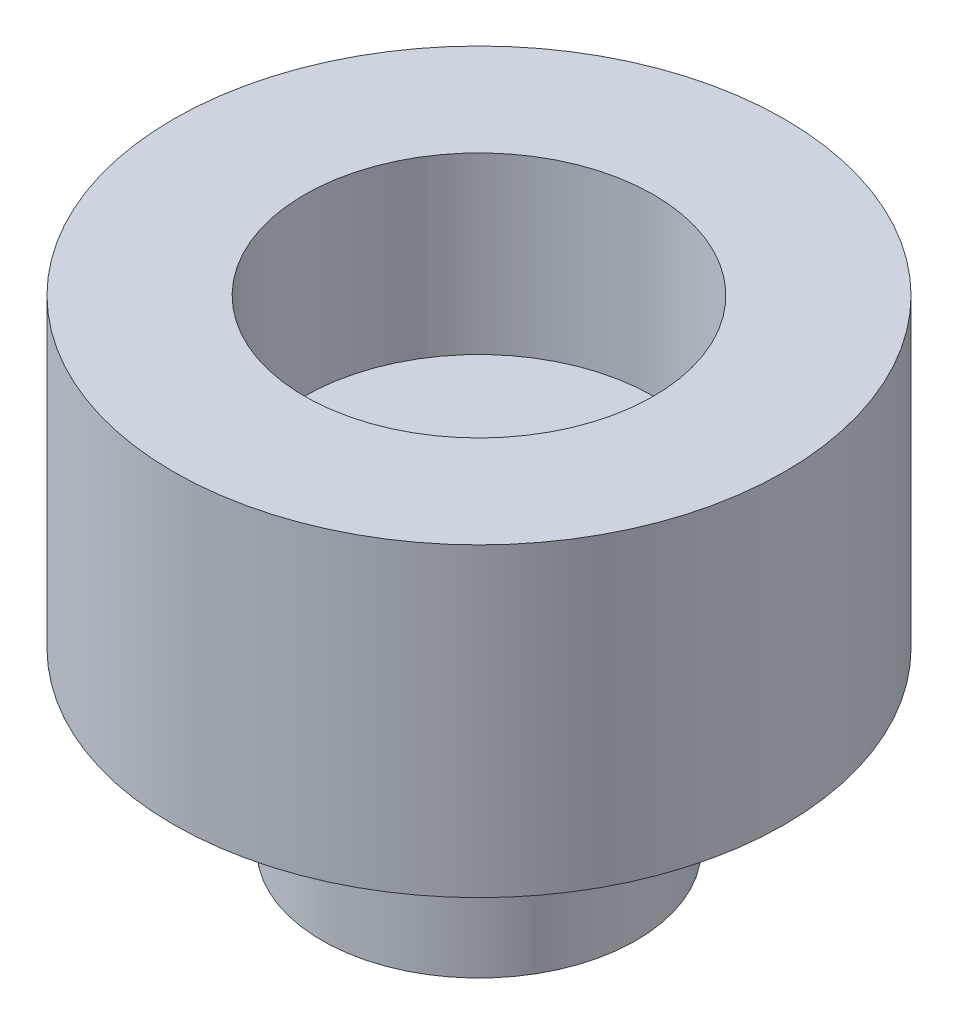
ISO-10303-21;
HEADER;
FILE_DESCRIPTION(('STEP AP214'),'2;1');
FILE_NAME('part.step','',(''),(''),'','','');
FILE_SCHEMA(('AUTOMOTIVE_DESIGN { 1 0 10303 214 1 1 1 1 }'));
ENDSEC;
DATA;
#1=APPLICATION_CONTEXT('core data for automotive mechanical design processes');
#2=APPLICATION_PROTOCOL_DEFINITION('international standard','automotive_design',2000,#1);
#3=PRODUCT_CONTEXT('',#1,'mechanical');
#4=PRODUCT('Part','Part','',(#3));
#5=PRODUCT_RELATED_PRODUCT_CATEGORY('part','',(#4));
#6=PRODUCT_DEFINITION_FORMATION('','',#4);
#7=PRODUCT_DEFINITION_CONTEXT('part definition',#1,'design');
#8=PRODUCT_DEFINITION('design','',#6,#7);
#9=PRODUCT_DEFINITION_SHAPE('','',#8);
#10=(LENGTH_UNIT() NAMED_UNIT(*) SI_UNIT(.MILLI.,.METRE.));
#11=(NAMED_UNIT(*) PLANE_ANGLE_UNIT() SI_UNIT($,.RADIAN.));
#12=(NAMED_UNIT(*) SI_UNIT($,.STERADIAN.) SOLID_ANGLE_UNIT());
#13=UNCERTAINTY_MEASURE_WITH_UNIT(LENGTH_MEASURE(1.E-05),#10,'distance_accuracy_value','');
#14=(GEOMETRIC_REPRESENTATION_CONTEXT(3) GLOBAL_UNCERTAINTY_ASSIGNED_CONTEXT((#13)) GLOBAL_UNIT_ASSIGNED_CONTEXT((#10,
#11,#12)) REPRESENTATION_CONTEXT('',''));
#15=CARTESIAN_POINT('',(0.,0.,0.));
#16=DIRECTION('',(0.,0.,1.));
#17=DIRECTION('',(1.,0.,0.));
#18=AXIS2_PLACEMENT_3D('',#15,#16,#17);
#19=CARTESIAN_POINT('',(1.8,0.,0.));
#20=DIRECTION('',(0.,-1.,0.));
#21=DIRECTION('',(0.,0.,-1.));
#22=AXIS2_PLACEMENT_3D('',#19,#20,#21);
#23=PLANE('',#22);
#24=CARTESIAN_POINT('',(0.,0.,0.));
#25=DIRECTION('',(0.,-1.,0.));
#26=DIRECTION('',(0.,0.,-1.));
#27=AXIS2_PLACEMENT_3D('',#24,#25,#26);
#28=CIRCLE('',#27,1.8);
#29=CARTESIAN_POINT('',(0.,0.,-1.8));
#30=VERTEX_POINT('',#29);
#31=EDGE_CURVE('E70',#30,#30,#28,.T.);
#32=ORIENTED_EDGE('',*,*,#31,.T.);
#33=EDGE_LOOP('',(#32));
#34=FACE_BOUND('',#33,.T.);
#35=ADVANCED_FACE('F43',(#34),#23,.T.);
#36=CARTESIAN_POINT('',(0.,3.5,0.));
#37=DIRECTION('',(0.,1.,0.));
#38=DIRECTION('',(0.,0.,1.));
#39=AXIS2_PLACEMENT_3D('',#36,#37,#38);
#40=PLANE('',#39);
#41=CARTESIAN_POINT('',(0.,3.5,0.));
#42=DIRECTION('',(0.,-1.,0.));
#43=DIRECTION('',(0.,0.,-1.));
#44=AXIS2_PLACEMENT_3D('',#41,#42,#43);
#45=CIRCLE('',#44,2.);
#46=CARTESIAN_POINT('',(0.,3.5,-2.));
#47=VERTEX_POINT('',#46);
#48=EDGE_CURVE('E10',#47,#47,#45,.T.);
#49=ORIENTED_EDGE('',*,*,#48,.F.);
#50=EDGE_LOOP('',(#49));
#51=FACE_BOUND('',#50,.T.);
#52=ADVANCED_FACE('F88',(#51),#40,.T.);
#53=CARTESIAN_POINT('',(0.,0.,0.));
#54=DIRECTION('',(0.,-1.,0.));
#55=DIRECTION('',(0.,0.,-1.));
#56=AXIS2_PLACEMENT_3D('',#53,#54,#55);
#57=CYLINDRICAL_SURFACE('',#56,2.);
#58=ORIENTED_EDGE('',*,*,#48,.T.);
#59=EDGE_LOOP('',(#58));
#60=FACE_BOUND('',#59,.T.);
#61=CARTESIAN_POINT('',(0.,5.5,0.));
#62=DIRECTION('',(0.,-1.,0.));
#63=DIRECTION('',(0.,0.,-1.));
#64=AXIS2_PLACEMENT_3D('',#61,#62,#63);
#65=CIRCLE('',#64,2.);
#66=CARTESIAN_POINT('',(0.,5.5,-2.));
#67=VERTEX_POINT('',#66);
#68=EDGE_CURVE('E50',#67,#67,#65,.T.);
#69=ORIENTED_EDGE('',*,*,#68,.F.);
#70=EDGE_LOOP('',(#69));
#71=FACE_BOUND('',#70,.T.);
#72=ADVANCED_FACE('F92',(#60,#71),#57,.F.);
#73=CARTESIAN_POINT('',(2.,5.5,0.));
#74=DIRECTION('',(0.,1.,0.));
#75=DIRECTION('',(0.,0.,1.));
#76=AXIS2_PLACEMENT_3D('',#73,#74,#75);
#77=PLANE('',#76);
#78=ORIENTED_EDGE('',*,*,#68,.T.);
#79=EDGE_LOOP('',(#78));
#80=FACE_BOUND('',#79,.T.);
#81=CARTESIAN_POINT('',(0.,5.5,0.));
#82=DIRECTION('',(0.,-1.,0.));
#83=DIRECTION('',(0.,0.,-1.));
#84=AXIS2_PLACEMENT_3D('',#81,#82,#83);
#85=CIRCLE('',#84,3.5);
#86=CARTESIAN_POINT('',(0.,5.5,-3.5));
#87=VERTEX_POINT('',#86);
#88=EDGE_CURVE('E55',#87,#87,#85,.T.);
#89=ORIENTED_EDGE('',*,*,#88,.F.);
#90=EDGE_LOOP('',(#89));
#91=FACE_BOUND('',#90,.T.);
#92=ADVANCED_FACE('F97',(#80,#91),#77,.T.);
#93=CARTESIAN_POINT('',(0.,0.,0.));
#94=DIRECTION('',(0.,-1.,0.));
#95=DIRECTION('',(0.,0.,-1.));
#96=AXIS2_PLACEMENT_3D('',#93,#94,#95);
#97=CYLINDRICAL_SURFACE('',#96,3.5);
#98=ORIENTED_EDGE('',*,*,#88,.T.);
#99=EDGE_LOOP('',(#98));
#100=FACE_BOUND('',#99,.T.);
#101=CARTESIAN_POINT('',(0.,2.,0.));
#102=DIRECTION('',(0.,-1.,0.));
#103=DIRECTION('',(0.,0.,-1.));
#104=AXIS2_PLACEMENT_3D('',#101,#102,#103);
#105=CIRCLE('',#104,3.5);
#106=CARTESIAN_POINT('',(0.,2.,-3.5));
#107=VERTEX_POINT('',#106);
#108=EDGE_CURVE('E60',#107,#107,#105,.T.);
#109=ORIENTED_EDGE('',*,*,#108,.F.);
#110=EDGE_LOOP('',(#109));
#111=FACE_BOUND('',#110,.T.);
#112=ADVANCED_FACE('F84',(#100,#111),#97,.T.);
#113=CARTESIAN_POINT('',(3.5,2.,0.));
#114=DIRECTION('',(0.,-1.,0.));
#115=DIRECTION('',(0.,0.,-1.));
#116=AXIS2_PLACEMENT_3D('',#113,#114,#115);
#117=PLANE('',#116);
#118=ORIENTED_EDGE('',*,*,#108,.T.);
#119=EDGE_LOOP('',(#118));
#120=FACE_BOUND('',#119,.T.);
#121=CARTESIAN_POINT('',(0.,2.,0.));
#122=DIRECTION('',(0.,-1.,0.));
#123=DIRECTION('',(0.,0.,-1.));
#124=AXIS2_PLACEMENT_3D('',#121,#122,#123);
#125=CIRCLE('',#124,1.8);
#126=CARTESIAN_POINT('',(0.,2.,-1.8));
#127=VERTEX_POINT('',#126);
#128=EDGE_CURVE('E66',#127,#127,#125,.T.);
#129=ORIENTED_EDGE('',*,*,#128,.F.);
#130=EDGE_LOOP('',(#129));
#131=FACE_BOUND('',#130,.T.);
#132=ADVANCED_FACE('F78',(#120,#131),#117,.T.);
#133=CARTESIAN_POINT('',(0.,0.,0.));
#134=DIRECTION('',(0.,-1.,0.));
#135=DIRECTION('',(0.,0.,-1.));
#136=AXIS2_PLACEMENT_3D('',#133,#134,#135);
#137=CYLINDRICAL_SURFACE('',#136,1.8);
#138=ORIENTED_EDGE('',*,*,#128,.T.);
#139=EDGE_LOOP('',(#138));
#140=FACE_BOUND('',#139,.T.);
#141=ORIENTED_EDGE('',*,*,#31,.F.);
#142=EDGE_LOOP('',(#141));
#143=FACE_BOUND('',#142,.T.);
#144=ADVANCED_FACE('F76',(#140,#143),#137,.T.);
#145=CLOSED_SHELL('',(#35,#52,#72,#92,#112,#132,#144));
#146=MANIFOLD_SOLID_BREP('B2',#145);
#147=ADVANCED_BREP_SHAPE_REPRESENTATION('',(#18,#146),#14);
#148=SHAPE_DEFINITION_REPRESENTATION(#9,#147);
ENDSEC;
END-ISO-10303-21;
